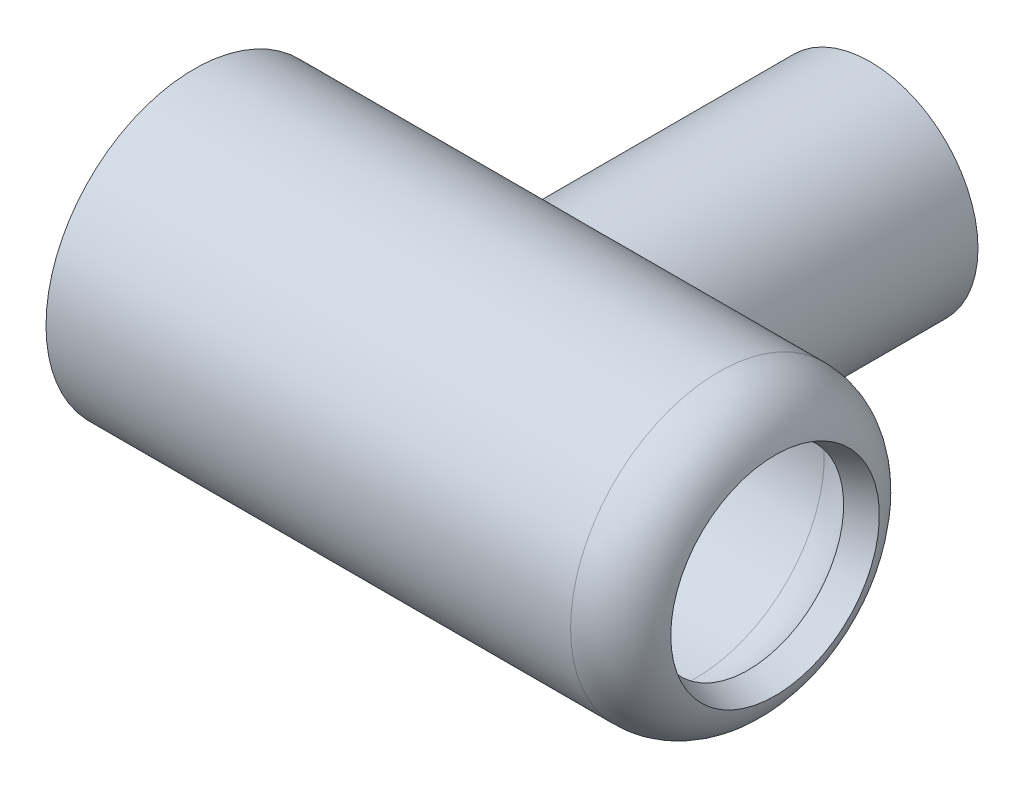
ISO-10303-21;
HEADER;
FILE_DESCRIPTION(('STEP AP214'),'2;1');
FILE_NAME('part.step','',(''),(''),'','','');
FILE_SCHEMA(('AUTOMOTIVE_DESIGN { 1 0 10303 214 1 1 1 1 }'));
ENDSEC;
DATA;
#1=APPLICATION_CONTEXT('core data for automotive mechanical design processes');
#2=APPLICATION_PROTOCOL_DEFINITION('international standard','automotive_design',2000,#1);
#3=PRODUCT_CONTEXT('',#1,'mechanical');
#4=PRODUCT('Part','Part','',(#3));
#5=PRODUCT_RELATED_PRODUCT_CATEGORY('part','',(#4));
#6=PRODUCT_DEFINITION_FORMATION('','',#4);
#7=PRODUCT_DEFINITION_CONTEXT('part definition',#1,'design');
#8=PRODUCT_DEFINITION('design','',#6,#7);
#9=PRODUCT_DEFINITION_SHAPE('','',#8);
#10=(LENGTH_UNIT() NAMED_UNIT(*) SI_UNIT(.MILLI.,.METRE.));
#11=(NAMED_UNIT(*) PLANE_ANGLE_UNIT() SI_UNIT($,.RADIAN.));
#12=(NAMED_UNIT(*) SI_UNIT($,.STERADIAN.) SOLID_ANGLE_UNIT());
#13=UNCERTAINTY_MEASURE_WITH_UNIT(LENGTH_MEASURE(1.E-05),#10,'distance_accuracy_value','');
#14=(GEOMETRIC_REPRESENTATION_CONTEXT(3) GLOBAL_UNCERTAINTY_ASSIGNED_CONTEXT((#13)) GLOBAL_UNIT_ASSIGNED_CONTEXT((#10,
#11,#12)) REPRESENTATION_CONTEXT('',''));
#15=CARTESIAN_POINT('',(0.,0.,0.));
#16=DIRECTION('',(0.,0.,1.));
#17=DIRECTION('',(1.,0.,0.));
#18=AXIS2_PLACEMENT_3D('',#15,#16,#17);
#19=CARTESIAN_POINT('',(0.,0.,-30.));
#20=DIRECTION('',(0.,0.,1.));
#21=DIRECTION('',(1.,0.,0.));
#22=AXIS2_PLACEMENT_3D('',#19,#20,#21);
#23=CYLINDRICAL_SURFACE('',#22,9.25);
#24=CARTESIAN_POINT('',(9.25,0.,-11.05));
#25=CARTESIAN_POINT('',(9.24999984790177,-0.219475563396185,-11.0499998511439));
#26=CARTESIAN_POINT('',(9.24217594061111,-0.438953172904047,-11.043447960009));
#27=CARTESIAN_POINT('',(9.21103047976468,-0.87602698176633,-11.017395795229));
#28=CARTESIAN_POINT('',(9.18770866791062,-1.09362314970217,-10.9978953057739));
#29=CARTESIAN_POINT('',(9.12599057821345,-1.52523537385702,-10.9463882344754));
#30=CARTESIAN_POINT('',(9.08758873725162,-1.7392500784386,-10.914377037373));
#31=CARTESIAN_POINT('',(8.99638048454629,-2.16203909123416,-10.8385524852219));
#32=CARTESIAN_POINT('',(8.94357382332977,-2.37081330862125,-10.7947389257717));
#33=CARTESIAN_POINT('',(8.82476465701185,-2.78051169770847,-10.6965116730655));
#34=CARTESIAN_POINT('',(8.75884613028088,-2.98147656538516,-10.6421654928424));
#35=CARTESIAN_POINT('',(8.6144938345716,-3.37596462433872,-10.5236782544412));
#36=CARTESIAN_POINT('',(8.53605459417016,-3.56948451614403,-10.4595329146602));
#37=CARTESIAN_POINT('',(8.36762935225269,-3.94819258808527,-10.3225394304284));
#38=CARTESIAN_POINT('',(8.27764453746544,-4.13338162188209,-10.2496921804692));
#39=CARTESIAN_POINT('',(8.08702217098376,-4.49492548486011,-10.0963717258381));
#40=CARTESIAN_POINT('',(7.98638234843411,-4.67127841899545,-10.0158968959177));
#41=CARTESIAN_POINT('',(7.73630076915851,-5.07822288901348,-9.81746366437749));
#42=CARTESIAN_POINT('',(7.58256266278203,-5.30479121887937,-9.69663853512004));
#43=CARTESIAN_POINT('',(7.25857034686547,-5.74015201427548,-9.44544152437032));
#44=CARTESIAN_POINT('',(7.08831051742851,-5.94893838557251,-9.31506639815043));
#45=CARTESIAN_POINT('',(6.73233467193815,-6.34901945352247,-9.04712936638895));
#46=CARTESIAN_POINT('',(6.54658104001906,-6.54026906591065,-8.90955029105953));
#47=CARTESIAN_POINT('',(6.16106222659249,-6.90464828624756,-8.63023868712287));
#48=CARTESIAN_POINT('',(5.96129882599346,-7.07778019035416,-8.48850668776014));
#49=CARTESIAN_POINT('',(5.54444735031626,-7.40903552787645,-8.20107647547176));
#50=CARTESIAN_POINT('',(5.32710513637502,-7.56681771086846,-8.05535365969262));
#51=CARTESIAN_POINT('',(4.87848193491632,-7.86354173275174,-7.76596131282176));
#52=CARTESIAN_POINT('',(4.64719631329281,-8.00247725751861,-7.62229248422018));
#53=CARTESIAN_POINT('',(4.17088447243069,-8.26071590138977,-7.3416157162202));
#54=CARTESIAN_POINT('',(3.92589186217582,-8.38006444224244,-7.20459290047123));
#55=CARTESIAN_POINT('',(3.42117370370125,-8.59846987347771,-6.94246942818835));
#56=CARTESIAN_POINT('',(3.16146088218024,-8.69754396093022,-6.81735871622195));
#57=CARTESIAN_POINT('',(2.60263157237528,-8.88158619091727,-6.57608525962632));
#58=CARTESIAN_POINT('',(2.30205617550612,-8.96455900794652,-6.46166581235096));
#59=CARTESIAN_POINT('',(1.83837107993512,-9.06685765100913,-6.3164969444914));
#60=CARTESIAN_POINT('',(1.68177841068803,-9.09725118558168,-6.27253738536209));
#61=CARTESIAN_POINT('',(1.36475820022087,-9.15017643329354,-6.19507607178537));
#62=CARTESIAN_POINT('',(1.2043327367338,-9.17271230713419,-6.16156878376063));
#63=CARTESIAN_POINT('',(0.878321086676945,-9.20968572687295,-6.10617114944698));
#64=CARTESIAN_POINT('',(0.712694687428108,-9.22401203455807,-6.08444057993509));
#65=CARTESIAN_POINT('',(0.379690168949532,-9.24370832633351,-6.05447637054362));
#66=CARTESIAN_POINT('',(0.212312226858201,-9.24907920746872,-6.04624137884387));
#67=CARTESIAN_POINT('',(-0.122573752384285,-9.25070314279064,-6.04375667710054));
#68=CARTESIAN_POINT('',(-0.290081771059277,-9.24695731531173,-6.04950525171168));
#69=CARTESIAN_POINT('',(-0.623621637092969,-9.23046528863819,-6.07463818081445));
#70=CARTESIAN_POINT('',(-0.789653309112418,-9.21771803446674,-6.09402413362041));
#71=CARTESIAN_POINT('',(-1.13075416725186,-9.18234118326979,-6.14721048205164));
#72=CARTESIAN_POINT('',(-1.30560744269212,-9.15906296095605,-6.18195281152572));
#73=CARTESIAN_POINT('',(-1.65089631252135,-9.10316816209196,-6.26396677829748));
#74=CARTESIAN_POINT('',(-1.82132872099878,-9.07054504441998,-6.31124719011653));
#75=CARTESIAN_POINT('',(-2.15746224667918,-8.99653061015856,-6.41631256281838));
#76=CARTESIAN_POINT('',(-2.32314906907296,-8.95511543551775,-6.47412604436921));
#77=CARTESIAN_POINT('',(-2.64900654193515,-8.8641906278843,-6.59807084176366));
#78=CARTESIAN_POINT('',(-2.80917827394678,-8.81468259302302,-6.66420051478017));
#79=CARTESIAN_POINT('',(-3.21836227995002,-8.67613466863344,-6.84446347956587));
#80=CARTESIAN_POINT('',(-3.46315997680085,-8.58117111020339,-6.96363557629632));
#81=CARTESIAN_POINT('',(-3.93948014549122,-8.37320647392234,-7.21236812006209));
#82=CARTESIAN_POINT('',(-4.17099452608335,-8.26019455757433,-7.34193478588424));
#83=CARTESIAN_POINT('',(-4.62161999050188,-8.01678089945095,-7.60698056137561));
#84=CARTESIAN_POINT('',(-4.84071366113781,-7.88635556387881,-7.74246752200296));
#85=CARTESIAN_POINT('',(-5.2664513599173,-7.60865057506423,-8.01553948277696));
#86=CARTESIAN_POINT('',(-5.47309792897594,-7.46137437962793,-8.15312404748959));
#87=CARTESIAN_POINT('',(-5.88520606722834,-7.14133537435293,-8.4351550590827));
#88=CARTESIAN_POINT('',(-6.08995172036423,-6.96760661415703,-8.57955377456256));
#89=CARTESIAN_POINT('',(-6.48506561607858,-6.60143679304037,-8.86438675000016));
#90=CARTESIAN_POINT('',(-6.67543173961235,-6.40899298369074,-9.00482042374598));
#91=CARTESIAN_POINT('',(-7.04037482068938,-6.0057825166619,-9.27859691115925));
#92=CARTESIAN_POINT('',(-7.21497980693657,-5.79504974698625,-9.41195213145355));
#93=CARTESIAN_POINT('',(-7.54723479240589,-5.35515294864625,-9.66900643646152));
#94=CARTESIAN_POINT('',(-7.7048901898419,-5.12599482908953,-9.79270859208347));
#95=CARTESIAN_POINT('',(-7.96639712522203,-4.70584699833509,-9.99993609582096));
#96=CARTESIAN_POINT('',(-8.07417652533914,-4.5185755383881,-10.0860631142266));
#97=CARTESIAN_POINT('',(-8.2776723806442,-4.1339984927832,-10.2496926535089));
#98=CARTESIAN_POINT('',(-8.37339164327219,-3.93669525745518,-10.3271971810938));
#99=CARTESIAN_POINT('',(-8.5516586903294,-3.53275393327006,-10.4722578309749));
#100=CARTESIAN_POINT('',(-8.63421042881198,-3.32611867071776,-10.5398169392926));
#101=CARTESIAN_POINT('',(-8.78504459717026,-2.90441536254658,-10.6637310105243));
#102=CARTESIAN_POINT('',(-8.85332681533589,-2.68934719186889,-10.7200858072048));
#103=CARTESIAN_POINT('',(-8.97501703344195,-2.25030449869418,-10.8208019252237));
#104=CARTESIAN_POINT('',(-9.02830005161572,-2.02627193837988,-10.8650623853341));
#105=CARTESIAN_POINT('',(-9.11826608955385,-1.5726358520789,-10.9399338934061));
#106=CARTESIAN_POINT('',(-9.15494905809863,-1.34303230890522,-10.9705448992523));
#107=CARTESIAN_POINT('',(-9.21095389091431,-0.880390477995762,-11.0173242820229));
#108=CARTESIAN_POINT('',(-9.23028607051114,-0.647354314887699,-11.0335012401896));
#109=CARTESIAN_POINT('',(-9.2512068385087,-0.179942402138984,-11.051008719203));
#110=CARTESIAN_POINT('',(-9.25279752844771,0.054433185551671,-11.052340998451));
#111=CARTESIAN_POINT('',(-9.23912614314128,0.492932287943069,-11.0408986840311));
#112=CARTESIAN_POINT('',(-9.22594791295366,0.697171565561707,-11.029868393726));
#113=CARTESIAN_POINT('',(-9.18621730788201,1.10343163356705,-10.9966571634153));
#114=CARTESIAN_POINT('',(-9.15966489329301,1.30545241736573,-10.9744761903059));
#115=CARTESIAN_POINT('',(-9.09360761071867,1.70586671239275,-10.9194032536993));
#116=CARTESIAN_POINT('',(-9.05410289728158,1.90426026687177,-10.8865114180054));
#117=CARTESIAN_POINT('',(-8.96272538004675,2.29620385341426,-10.8106335825424));
#118=CARTESIAN_POINT('',(-8.91085199344209,2.48975365676713,-10.7676471071194));
#119=CARTESIAN_POINT('',(-8.79507814043273,2.87215269129954,-10.672034837037));
#120=CARTESIAN_POINT('',(-8.73110487663713,3.06096519937795,-10.6193507522073));
#121=CARTESIAN_POINT('',(-8.59209609707458,3.43185452968389,-10.5053573398748));
#122=CARTESIAN_POINT('',(-8.51705658043059,3.61392888590253,-10.4440448932548));
#123=CARTESIAN_POINT('',(-8.35672379659058,3.97063015194817,-10.3137118305782));
#124=CARTESIAN_POINT('',(-8.27143075731352,4.14525722719914,-10.2446913858601));
#125=CARTESIAN_POINT('',(-8.09134678774751,4.48663196442822,-10.0998530668948));
#126=CARTESIAN_POINT('',(-7.99655394752557,4.65337803197465,-10.0240338260748));
#127=CARTESIAN_POINT('',(-7.75385489804663,5.05135585812689,-9.83130905509905));
#128=CARTESIAN_POINT('',(-7.60113967445834,5.27811622144453,-9.71118073621462));
#129=CARTESIAN_POINT('',(-7.27919303483013,5.71395812791693,-9.46130740518942));
#130=CARTESIAN_POINT('',(-7.10995530416116,5.92303285448717,-9.33155872089676));
#131=CARTESIAN_POINT('',(-6.75601390173961,6.32379932709354,-9.06477520340999));
#132=CARTESIAN_POINT('',(-6.57127068873758,6.5154438635509,-8.92772208860068));
#133=CARTESIAN_POINT('',(-6.18779517724358,6.88068386893602,-8.64935849324016));
#134=CARTESIAN_POINT('',(-5.98906478513463,7.05428178956968,-8.50804859436341));
#135=CARTESIAN_POINT('',(-5.57446183290055,7.38645486831052,-8.22142060236954));
#136=CARTESIAN_POINT('',(-5.35834410930944,7.54470124995016,-8.0760762550596));
#137=CARTESIAN_POINT('',(-4.9122527241925,7.84246355423085,-7.78725124284645));
#138=CARTESIAN_POINT('',(-4.68227458783142,7.98197338033372,-7.64377119820436));
#139=CARTESIAN_POINT('',(-4.20866647991528,8.24150243000036,-7.36318828644399));
#140=CARTESIAN_POINT('',(-3.96506894371241,8.36156551264742,-7.22607158099784));
#141=CARTESIAN_POINT('',(-3.46325642757647,8.58157416449509,-6.96336173804626));
#142=CARTESIAN_POINT('',(-3.20505357991527,8.68153612567745,-6.8377592568258));
#143=CARTESIAN_POINT('',(-2.64721232619546,8.86844052572504,-6.59386432162918));
#144=CARTESIAN_POINT('',(-2.34597680629879,8.95320749525155,-6.47743542289903));
#145=CARTESIAN_POINT('',(-1.88106347759939,9.05810689362251,-6.32905281128194));
#146=CARTESIAN_POINT('',(-1.72401742116224,9.08935231946447,-6.28398861202101));
#147=CARTESIAN_POINT('',(-1.40599004601853,9.14394286495775,-6.20428375609671));
#148=CARTESIAN_POINT('',(-1.24501086891687,9.16729218562756,-6.16963755776436));
#149=CARTESIAN_POINT('',(-0.917703090484504,9.2058586882448,-6.11194733867261));
#150=CARTESIAN_POINT('',(-0.751331504840967,9.22096089246174,-6.08906760433492));
#151=CARTESIAN_POINT('',(-0.416702137389746,9.24212924471384,-6.05689067997035));
#152=CARTESIAN_POINT('',(-0.248444555980082,9.24819634378122,-6.04759206040175));
#153=CARTESIAN_POINT('',(0.088299980892322,9.25111050047042,-6.04313357048401));
#154=CARTESIAN_POINT('',(0.256786868961206,9.24795984901919,-6.04797018704389));
#155=CARTESIAN_POINT('',(0.592369066327459,9.23254161063474,-6.07147971234821));
#156=CARTESIAN_POINT('',(0.759464219882389,9.22027301685636,-6.09015414912778));
#157=CARTESIAN_POINT('',(1.10079575913172,9.18596326507257,-6.14179043987249));
#158=CARTESIAN_POINT('',(1.27485590263164,9.16337788695835,-6.17554526166872));
#159=CARTESIAN_POINT('',(1.61866637909767,9.10893802670849,-6.2555637468479));
#160=CARTESIAN_POINT('',(1.78841365368383,9.07707715610996,-6.30183603002838));
#161=CARTESIAN_POINT('',(2.12326624809853,9.00464733630164,-6.40490388828262));
#162=CARTESIAN_POINT('',(2.28835747629999,8.96405461574073,-6.4617281307979));
#163=CARTESIAN_POINT('',(2.61309608067021,8.87482856202199,-6.58374031539569));
#164=CARTESIAN_POINT('',(2.7727445004142,8.82619678080878,-6.64892664263064));
#165=CARTESIAN_POINT('',(3.1803193932837,8.69010434752907,-6.82667315838651));
#166=CARTESIAN_POINT('',(3.42409302635456,8.59678715339463,-6.94429602563036));
#167=CARTESIAN_POINT('',(3.89851395476224,8.39231014596728,-7.19007955357911));
#168=CARTESIAN_POINT('',(4.12915322378428,8.28113957778845,-7.31824654322928));
#169=CARTESIAN_POINT('',(4.57817437077003,8.04161895829167,-7.58066462032145));
#170=CARTESIAN_POINT('',(4.79653898412107,7.91324552855143,-7.71492381980958));
#171=CARTESIAN_POINT('',(5.22098135669022,7.63986625752204,-7.98573584082098));
#172=CARTESIAN_POINT('',(5.42706162220897,7.49486382672016,-8.12228818715024));
#173=CARTESIAN_POINT('',(5.83850694174697,7.17950753313178,-8.40263133436963));
#174=CARTESIAN_POINT('',(6.04314761575141,7.00817470253424,-8.54638621017379));
#175=CARTESIAN_POINT('',(6.43827414331525,6.64701152361345,-8.83020405202089));
#176=CARTESIAN_POINT('',(6.62875794507175,6.45717850317505,-8.9702664810143));
#177=CARTESIAN_POINT('',(6.99423697914736,6.05937092246888,-9.243629055484));
#178=CARTESIAN_POINT('',(7.16925804952493,5.85142782485,-9.37694031662278));
#179=CARTESIAN_POINT('',(7.50268772686891,5.41729025495941,-9.63426671657479));
#180=CARTESIAN_POINT('',(7.66110141267936,5.19110140023934,-9.75828469411667));
#181=CARTESIAN_POINT('',(7.92561464773022,4.77425188645936,-9.96746700868186));
#182=CARTESIAN_POINT('',(8.03543193349589,4.58716334301638,-10.0550653418387));
#183=CARTESIAN_POINT('',(8.24299109215213,4.20277088922744,-10.2216961402801));
#184=CARTESIAN_POINT('',(8.34073575619631,4.00546935511982,-10.3007305849893));
#185=CARTESIAN_POINT('',(8.52300362727653,3.60138900070962,-10.4488647359781));
#186=CARTESIAN_POINT('',(8.60753448996895,3.3946157584839,-10.5179701929067));
#187=CARTESIAN_POINT('',(8.76228737968885,2.97243129794445,-10.6449859281971));
#188=CARTESIAN_POINT('',(8.83251029766092,2.75702061847752,-10.702896903619));
#189=CARTESIAN_POINT('',(8.9528535300728,2.33524049858642,-10.8024317230301));
#190=CARTESIAN_POINT('',(9.00408435445501,2.12939936554257,-10.8449496199054));
#191=CARTESIAN_POINT('',(9.09255019859767,1.71271175399497,-10.9185101727583));
#192=CARTESIAN_POINT('',(9.12978616090286,1.50186561359239,-10.9495536015314));
#193=CARTESIAN_POINT('',(9.18962281503975,1.0767492865727,-10.9994952443513));
#194=CARTESIAN_POINT('',(9.21222853537133,0.862480302380759,-11.0183976313283));
#195=CARTESIAN_POINT('',(9.24241733580852,0.432141561064338,-11.043650193628));
#196=CARTESIAN_POINT('',(9.25000014973937,0.216071772101443,-11.0500001465475));
#197=CARTESIAN_POINT('',(9.25,0.,-11.05));
#198=B_SPLINE_CURVE_WITH_KNOTS('',3,(#24,#25,#26,#27,#28,#29,#30,#31,#32,#33,#34,#35,#36,#37,
#38,#39,#40,#41,#42,#43,#44,#45,#46,#47,#48,#49,#50,#51,#52,#53,#54,#55,#56,#57,#58,#59,#60,#61,
#62,#63,#64,#65,#66,#67,#68,#69,#70,#71,#72,#73,#74,#75,#76,#77,#78,#79,#80,#81,#82,#83,#84,#85,
#86,#87,#88,#89,#90,#91,#92,#93,#94,#95,#96,#97,#98,#99,#100,#101,#102,#103,#104,#105,#106,#107,
#108,#109,#110,#111,#112,#113,#114,#115,#116,#117,#118,#119,#120,#121,#122,#123,#124,#125,#126,
#127,#128,#129,#130,#131,#132,#133,#134,#135,#136,#137,#138,#139,#140,#141,#142,#143,#144,#145,
#146,#147,#148,#149,#150,#151,#152,#153,#154,#155,#156,#157,#158,#159,#160,#161,#162,#163,#164,
#165,#166,#167,#168,#169,#170,#171,#172,#173,#174,#175,#176,#177,#178,#179,#180,#181,#182,#183,
#184,#185,#186,#187,#188,#189,#190,#191,#192,#193,#194,#195,#196,#197),.UNSPECIFIED.,.T.,.F.,(4,
2,2,2,2,2,2,2,2,2,2,2,2,2,2,2,2,2,2,2,2,2,2,2,2,2,2,2,2,2,2,2,2,2,2,2,2,2,2,2,2,2,2,2,2,2,2,2,2,
2,2,2,2,2,2,2,2,2,2,2,2,2,2,2,2,2,2,2,2,2,2,2,2,2,2,2,2,2,2,2,2,2,2,2,2,2,4),(0.,
0.658195646689237,1.31640226357668,1.97485192552973,2.63331299171081,3.28768521724641,
3.94234418352291,4.59693591354437,5.25166743575531,6.14820913167326,7.04505686420874,
7.94414914316033,8.84312733679823,9.75891849503526,10.6750157135187,11.5889575517297,
12.5021209289998,13.4952592476201,13.9911835897118,14.4868449352297,14.9890725915929,
15.4912499379216,15.9933656859366,16.4955402922246,17.0340699475861,17.5729774811206,
18.1133665220052,18.6536489786078,19.5173522653488,20.3815761918042,21.2469831865889,
22.1122129167721,23.0259492700112,23.9398200147055,24.8520321762132,25.7639529444673,
26.4611458530952,27.1581761634193,27.8549967680416,28.5518277103248,29.2543038816235,
29.9567822204023,30.6588426472191,31.3608199117668,31.9749602626679,32.5891024368247,
33.2032372832361,33.8174010731561,34.4353847380697,35.053592378146,35.6717862790217,
36.2901047179471,37.1846588957046,38.0795563056963,38.9768095322931,39.8739407036665,
40.78730961455,41.7009750029232,42.6125501715329,43.5233789306775,44.5217700795331,
45.0203458487147,45.5186559383743,46.0237465664841,46.5287840251606,47.0336959753825,
47.5386636885914,48.0740532028469,48.6098123406839,49.1470489026753,49.6841818717463,
50.5417453288254,51.3998273340518,52.2590875144917,53.1181717810169,54.0267202923419,
54.9354002268892,55.8425318548439,56.7493852509728,57.4506298372784,58.1517119932693,
58.8523864469486,59.5530172568312,60.2012602070738,60.849459490754,61.4974358660589,
62.1454237220594),.UNSPECIFIED.);
#199=CARTESIAN_POINT('',(5.24022900262957,-7.6224995900295,-8.));
#200=VERTEX_POINT('',#199);
#201=CARTESIAN_POINT('',(-5.24022900262957,-7.6224995900295,-8.));
#202=VERTEX_POINT('',#201);
#203=EDGE_CURVE('E82',#200,#202,#198,.T.);
#204=ORIENTED_EDGE('',*,*,#203,.F.);
#205=CARTESIAN_POINT('',(0.,0.,-8.));
#206=DIRECTION('',(0.,0.,1.));
#207=DIRECTION('',(1.,0.,0.));
#208=AXIS2_PLACEMENT_3D('',#205,#206,#207);
#209=CIRCLE('',#208,9.25);
#210=EDGE_CURVE('E11',#200,#202,#209,.F.);
#211=ORIENTED_EDGE('',*,*,#210,.T.);
#212=EDGE_LOOP('',(#204,#211));
#213=FACE_BOUND('',#212,.T.);
#214=ADVANCED_FACE('F35',(#213),#23,.F.);
#215=CARTESIAN_POINT('',(20.,0.,0.));
#216=DIRECTION('',(-1.,0.,0.));
#217=DIRECTION('',(0.,0.,1.));
#218=AXIS2_PLACEMENT_3D('',#215,#216,#217);
#219=TOROIDAL_SURFACE('',#218,7.7,5.);
#220=CARTESIAN_POINT('',(20.,0.,0.));
#221=DIRECTION('',(-1.,0.,0.));
#222=DIRECTION('',(0.,0.,1.));
#223=AXIS2_PLACEMENT_3D('',#220,#221,#222);
#224=CIRCLE('',#223,12.7);
#225=CARTESIAN_POINT('',(20.,0.,12.7));
#226=VERTEX_POINT('',#225);
#227=EDGE_CURVE('E148',#226,#226,#224,.T.);
#228=ORIENTED_EDGE('',*,*,#227,.F.);
#229=EDGE_LOOP('',(#228));
#230=FACE_BOUND('',#229,.T.);
#231=CARTESIAN_POINT('',(24.841923498959,0.,0.));
#232=DIRECTION('',(-1.,0.,0.));
#233=DIRECTION('',(0.,0.,1.));
#234=AXIS2_PLACEMENT_3D('',#231,#232,#233);
#235=CIRCLE('',#234,8.94730783298631);
#236=CARTESIAN_POINT('',(24.841923498959,0.,8.94730783298631));
#237=VERTEX_POINT('',#236);
#238=EDGE_CURVE('E127',#237,#237,#235,.F.);
#239=ORIENTED_EDGE('',*,*,#238,.F.);
#240=EDGE_LOOP('',(#239));
#241=FACE_BOUND('',#240,.T.);
#242=ADVANCED_FACE('F109',(#230,#241),#219,.T.);
#243=CARTESIAN_POINT('',(18.0198110801731,0.,0.));
#244=DIRECTION('',(-1.,0.,0.));
#245=DIRECTION('',(0.,0.,1.));
#246=AXIS2_PLACEMENT_3D('',#243,#244,#245);
#247=TOROIDAL_SURFACE('',#246,6.05,5.);
#248=CARTESIAN_POINT('',(18.0198110801731,0.,0.));
#249=DIRECTION('',(-1.,0.,0.));
#250=DIRECTION('',(0.,0.,1.));
#251=AXIS2_PLACEMENT_3D('',#248,#249,#250);
#252=CIRCLE('',#251,11.05);
#253=CARTESIAN_POINT('',(18.0198110801731,0.,11.05));
#254=VERTEX_POINT('',#253);
#255=EDGE_CURVE('E140',#254,#254,#252,.T.);
#256=ORIENTED_EDGE('',*,*,#255,.T.);
#257=EDGE_LOOP('',(#256));
#258=FACE_BOUND('',#257,.T.);
#259=CARTESIAN_POINT('',(22.542961879778,0.,0.));
#260=DIRECTION('',(-1.,0.,0.));
#261=DIRECTION('',(0.,0.,1.));
#262=AXIS2_PLACEMENT_3D('',#259,#260,#261);
#263=CIRCLE('',#262,8.18098729325934);
#264=CARTESIAN_POINT('',(22.542961879778,0.,8.18098729325934));
#265=VERTEX_POINT('',#264);
#266=EDGE_CURVE('E83',#265,#265,#263,.T.);
#267=ORIENTED_EDGE('',*,*,#266,.F.);
#268=EDGE_LOOP('',(#267));
#269=FACE_BOUND('',#268,.T.);
#270=ADVANCED_FACE('F114',(#258,#269),#247,.F.);
#271=CARTESIAN_POINT('',(-25.,11.05,0.));
#272=DIRECTION('',(1.,0.,0.));
#273=DIRECTION('',(0.,0.,-1.));
#274=AXIS2_PLACEMENT_3D('',#271,#272,#273);
#275=PLANE('',#274);
#276=CARTESIAN_POINT('',(-25.,0.,0.));
#277=DIRECTION('',(-1.,0.,0.));
#278=DIRECTION('',(0.,0.,1.));
#279=AXIS2_PLACEMENT_3D('',#276,#277,#278);
#280=CIRCLE('',#279,11.05);
#281=CARTESIAN_POINT('',(-25.,0.,11.05));
#282=VERTEX_POINT('',#281);
#283=EDGE_CURVE('E143',#282,#282,#280,.T.);
#284=ORIENTED_EDGE('',*,*,#283,.F.);
#285=EDGE_LOOP('',(#284));
#286=FACE_BOUND('',#285,.T.);
#287=CARTESIAN_POINT('',(-25.,0.,0.));
#288=DIRECTION('',(-1.,0.,0.));
#289=DIRECTION('',(0.,0.,1.));
#290=AXIS2_PLACEMENT_3D('',#287,#288,#289);
#291=CIRCLE('',#290,12.7);
#292=CARTESIAN_POINT('',(-25.,0.,12.7));
#293=VERTEX_POINT('',#292);
#294=EDGE_CURVE('E43',#293,#293,#291,.T.);
#295=ORIENTED_EDGE('',*,*,#294,.T.);
#296=EDGE_LOOP('',(#295));
#297=FACE_BOUND('',#296,.T.);
#298=ADVANCED_FACE('F37',(#286,#297),#275,.F.);
#299=CARTESIAN_POINT('',(-16.3508782201405,0.,0.));
#300=DIRECTION('',(-1.,0.,0.));
#301=DIRECTION('',(0.,0.,1.));
#302=AXIS2_PLACEMENT_3D('',#299,#300,#301);
#303=CYLINDRICAL_SURFACE('',#302,12.7);
#304=CARTESIAN_POINT('',(9.25,0.,-12.7));
#305=CARTESIAN_POINT('',(9.24999775552965,0.227497337947393,-12.6999978448739));
#306=CARTESIAN_POINT('',(9.24159196095742,0.455058623896146,-12.693871981559));
#307=CARTESIAN_POINT('',(9.20809602337804,0.908397768636302,-12.6695068691463));
#308=CARTESIAN_POINT('',(9.18299554363044,1.13417443476401,-12.6512601152438));
#309=CARTESIAN_POINT('',(9.11644474507044,1.58253043168526,-12.6030368434298));
#310=CARTESIAN_POINT('',(9.07495956537258,1.80510188950057,-12.5730353165828));
#311=CARTESIAN_POINT('',(8.97627677103815,2.24494338561071,-12.5019947586479));
#312=CARTESIAN_POINT('',(8.91907733093706,2.46221280479362,-12.4609544452388));
#313=CARTESIAN_POINT('',(8.79016908837589,2.88873038789043,-12.3690155235329));
#314=CARTESIAN_POINT('',(8.71855113500222,3.09801947224912,-12.3181787234372));
#315=CARTESIAN_POINT('',(8.56146904882757,3.50886348774257,-12.2075036840644));
#316=CARTESIAN_POINT('',(8.47600446975168,3.71041816933951,-12.1476651546671));
#317=CARTESIAN_POINT('',(8.29219394466985,4.10479276497837,-12.0201332161094));
#318=CARTESIAN_POINT('',(8.19385633278199,4.29761822262303,-11.9524448921848));
#319=CARTESIAN_POINT('',(7.98509748966168,4.67408469385908,-11.81031056227));
#320=CARTESIAN_POINT('',(7.87467208646203,4.85772250437135,-11.7358622246573));
#321=CARTESIAN_POINT('',(7.632031050348,5.2315060297549,-11.5743882969629));
#322=CARTESIAN_POINT('',(7.49874735767736,5.42072979637084,-11.4868344514325));
#323=CARTESIAN_POINT('',(7.21969985358629,5.78718310892157,-11.3066446228487));
#324=CARTESIAN_POINT('',(7.07393449616807,5.96441116416777,-11.2140080107482));
#325=CARTESIAN_POINT('',(6.77045226490591,6.30681352432602,-11.0250802067687));
#326=CARTESIAN_POINT('',(6.61271671038258,6.4719681648922,-10.9287834247682));
#327=CARTESIAN_POINT('',(6.28615132399003,6.78960049925168,-10.7343372314835));
#328=CARTESIAN_POINT('',(6.11732468371443,6.9420818115868,-10.6361883589052));
#329=CARTESIAN_POINT('',(5.73552817584094,7.2622057644727,-10.4208614570598));
#330=CARTESIAN_POINT('',(5.52030350456303,7.42714445751486,-10.3036453462798));
#331=CARTESIAN_POINT('',(5.07507268981407,7.73821090625323,-10.0721244971018));
#332=CARTESIAN_POINT('',(4.84506236194887,7.88433330141978,-9.95782059576283));
#333=CARTESIAN_POINT('',(4.37088530948964,8.15674860088281,-9.73592692615065));
#334=CARTESIAN_POINT('',(4.12673519387093,8.28306414893823,-9.62832957684015));
#335=CARTESIAN_POINT('',(3.62443642652803,8.51483270125321,-9.42398423087872));
#336=CARTESIAN_POINT('',(3.36629565762845,8.62029730112501,-9.32723021708254));
#337=CARTESIAN_POINT('',(2.92420203745972,8.77764070803567,-9.1788110244831));
#338=CARTESIAN_POINT('',(2.74389355708014,8.83571525617493,-9.12280594183249));
#339=CARTESIAN_POINT('',(2.37777887736829,8.94119312200592,-9.01945214577908));
#340=CARTESIAN_POINT('',(2.19197442032569,8.9885997813799,-8.97210072252057));
#341=CARTESIAN_POINT('',(1.81588195862567,9.0720504670981,-8.88771205856938));
#342=CARTESIAN_POINT('',(1.62560284705969,9.10811527115502,-8.85065597202734));
#343=CARTESIAN_POINT('',(1.2412640411032,9.16840174511015,-8.78819109240997));
#344=CARTESIAN_POINT('',(1.04720436066116,9.19262345869498,-8.76278225637045));
#345=CARTESIAN_POINT('',(0.65520676094939,9.22888023721227,-8.72459038102092));
#346=CARTESIAN_POINT('',(0.457250636784491,9.24082209603265,-8.71190392436783));
#347=CARTESIAN_POINT('',(0.0605779270172903,9.2519292833246,-8.70010763289236));
#348=CARTESIAN_POINT('',(-0.138138630118347,9.25109508547713,-8.7009972947262));
#349=CARTESIAN_POINT('',(-0.534702003239556,9.23666533860157,-8.7163134763842));
#350=CARTESIAN_POINT('',(-0.732548196522597,9.22306179704738,-8.73074847443811));
#351=CARTESIAN_POINT('',(-1.12560817778747,9.18338421768442,-8.77247251845071));
#352=CARTESIAN_POINT('',(-1.3208216688602,9.15730878522351,-8.79976300195134));
#353=CARTESIAN_POINT('',(-1.72928983017038,9.08953520593113,-8.86977887314796));
#354=CARTESIAN_POINT('',(-1.94206429823556,9.046394981791,-8.91390913870935));
#355=CARTESIAN_POINT('',(-2.36123442397036,8.94614847723056,-9.0145146593501));
#356=CARTESIAN_POINT('',(-2.5676291557739,8.88904018029796,-9.07099169675619));
#357=CARTESIAN_POINT('',(-3.17673061275179,8.69782075843905,-9.25576577237004));
#358=CARTESIAN_POINT('',(-3.56880449866105,8.5439098070468,-9.39930113537969));
#359=CARTESIAN_POINT('',(-4.19624493308215,8.24813051758972,-9.65833001573775));
#360=CARTESIAN_POINT('',(-4.44062780182628,8.11904924338558,-9.76744617453849));
#361=CARTESIAN_POINT('',(-4.91493511388047,7.8410084784474,-9.99202136661381));
#362=CARTESIAN_POINT('',(-5.14485499535528,7.69204276166846,-10.1074823798455));
#363=CARTESIAN_POINT('',(-5.58992236295057,7.37495943489047,-10.3411225820272));
#364=CARTESIAN_POINT('',(-5.80505626195298,7.20682457740155,-10.4593041412815));
#365=CARTESIAN_POINT('',(-6.21981702746308,6.85206664416553,-10.6950707638381));
#366=CARTESIAN_POINT('',(-6.41944561078695,6.66544562050875,-10.8126558918283));
#367=CARTESIAN_POINT('',(-6.80487547065578,6.27160753620899,-11.0458130475738));
#368=CARTESIAN_POINT('',(-6.99046461299787,6.0641553920778,-11.1613393948726));
#369=CARTESIAN_POINT('',(-7.34372838149935,5.63118176396323,-11.3859240490101));
#370=CARTESIAN_POINT('',(-7.51140112530964,5.40565838571044,-11.4949816756917));
#371=CARTESIAN_POINT('',(-7.82693262659388,4.93772201261491,-11.7036062601268));
#372=CARTESIAN_POINT('',(-7.97482930068131,4.69534273303147,-11.8031912706823));
#373=CARTESIAN_POINT('',(-8.24928901697643,4.19442581669496,-11.9903375803543));
#374=CARTESIAN_POINT('',(-8.3758600850527,3.93589430925623,-12.0779034005701));
#375=CARTESIAN_POINT('',(-8.57617677991944,3.4724749823013,-12.2177978471088));
#376=CARTESIAN_POINT('',(-8.65514751060455,3.27081880027654,-12.2734058808206));
#377=CARTESIAN_POINT('',(-8.79930855064291,2.86040975663414,-12.3754893560091));
#378=CARTESIAN_POINT('',(-8.86450188637223,2.65165846526497,-12.4219668029744));
#379=CARTESIAN_POINT('',(-8.98027467075167,2.2282953923368,-12.5048470805094));
#380=CARTESIAN_POINT('',(-9.03086174644695,2.01368673367202,-12.5412551686411));
#381=CARTESIAN_POINT('',(-9.11676352987143,1.57987651609724,-12.6032532411424));
#382=CARTESIAN_POINT('',(-9.1520778357033,1.36067483648271,-12.6288429408296));
#383=CARTESIAN_POINT('',(-9.20699684002945,0.918442912966964,-12.6686988950395));
#384=CARTESIAN_POINT('',(-9.2265422259311,0.695401407478521,-12.6829223952999));
#385=CARTESIAN_POINT('',(-9.24938559174513,0.248045080687156,-12.6995500753635));
#386=CARTESIAN_POINT('',(-9.25268359927994,0.023730261549666,-12.701954275261));
#387=CARTESIAN_POINT('',(-9.2429778375436,-0.424364777616784,-12.6948859216314));
#388=CARTESIAN_POINT('',(-9.22997343506502,-0.648144976542123,-12.6854129067774));
#389=CARTESIAN_POINT('',(-9.18787438130746,-1.09337212444351,-12.6548143650345));
#390=CARTESIAN_POINT('',(-9.1587801604804,-1.31481913567798,-12.6336891498776));
#391=CARTESIAN_POINT('',(-9.08708131203583,-1.74110963368111,-12.5818112088979));
#392=CARTESIAN_POINT('',(-9.0453475363388,-1.94617681153097,-12.5516803442714));
#393=CARTESIAN_POINT('',(-8.94852010598213,-2.3515815898465,-12.4820823119785));
#394=CARTESIAN_POINT('',(-8.89342190747695,-2.55191755624504,-12.4426119690422));
#395=CARTESIAN_POINT('',(-8.77054187578872,-2.94666257578482,-12.3550818054656));
#396=CARTESIAN_POINT('',(-8.70276325657768,-3.14107311629267,-12.3070241614959));
#397=CARTESIAN_POINT('',(-8.55520200082713,-3.52320742886746,-12.2031240393245));
#398=CARTESIAN_POINT('',(-8.47541495474628,-3.71092871316626,-12.147278702007));
#399=CARTESIAN_POINT('',(-8.29754239010115,-4.09408129940985,-12.0238212319202));
#400=CARTESIAN_POINT('',(-8.19849085365974,-4.28887351086173,-11.9556187122343));
#401=CARTESIAN_POINT('',(-7.988058643786,-4.66911819390237,-11.812308934749));
#402=CARTESIAN_POINT('',(-7.87667282881769,-4.85456672336078,-11.7371987997427));
#403=CARTESIAN_POINT('',(-7.6424006255712,-5.21560502901387,-11.5812840172369));
#404=CARTESIAN_POINT('',(-7.51951102883978,-5.39119203280936,-11.5004777826325));
#405=CARTESIAN_POINT('',(-7.26298022324007,-5.73211468706883,-11.3344088520253));
#406=CARTESIAN_POINT('',(-7.12933770367419,-5.89744908345735,-11.2491456131934));
#407=CARTESIAN_POINT('',(-6.82651787790576,-6.24691588945887,-11.0594963775991));
#408=CARTESIAN_POINT('',(-6.65531451960811,-6.42894752686993,-10.9544674340493));
#409=CARTESIAN_POINT('',(-6.29958439446142,-6.77789138808765,-10.742062377783));
#410=CARTESIAN_POINT('',(-6.11505999636555,-6.94480628811632,-10.6346866847225));
#411=CARTESIAN_POINT('',(-5.73304000554534,-7.26337890248446,-10.4197065293995));
#412=CARTESIAN_POINT('',(-5.53553187024721,-7.41502149456429,-10.3121019460553));
#413=CARTESIAN_POINT('',(-5.12809998913174,-7.70241729544077,-10.099244027165));
#414=CARTESIAN_POINT('',(-4.91817790983823,-7.83817262978375,-9.99399037861706));
#415=CARTESIAN_POINT('',(-4.51145021241329,-8.07826469746208,-9.8006399028041));
#416=CARTESIAN_POINT('',(-4.31598632290005,-8.18441902516553,-9.71197711183758));
#417=CARTESIAN_POINT('',(-3.91569445316561,-8.3833035582608,-9.54082965509789));
#418=CARTESIAN_POINT('',(-3.7108661900383,-8.47603335773252,-9.45834517617595));
#419=CARTESIAN_POINT('',(-3.29246991340516,-8.64714635765436,-9.30216431727592));
#420=CARTESIAN_POINT('',(-3.07891683445856,-8.72555291240136,-9.22845370100459));
#421=CARTESIAN_POINT('',(-2.64334767616888,-8.86722085714753,-9.09241721412003));
#422=CARTESIAN_POINT('',(-2.4213350552938,-8.93048836096085,-9.03008675011941));
#423=CARTESIAN_POINT('',(-2.01902230418669,-9.0287928502515,-8.93166444394412));
#424=CARTESIAN_POINT('',(-1.84016335858516,-9.06697716547636,-8.89281450095174));
#425=CARTESIAN_POINT('',(-1.47874121239024,-9.13288196796492,-8.82511787080327));
#426=CARTESIAN_POINT('',(-1.29618022664505,-9.16060852794946,-8.7962653790147));
#427=CARTESIAN_POINT('',(-0.928504439002111,-9.20514161146901,-8.74965214625542));
#428=CARTESIAN_POINT('',(-0.743392432572543,-9.22195924696764,-8.73188011930684));
#429=CARTESIAN_POINT('',(-0.371726062339842,-9.24440235304274,-8.70811670640765));
#430=CARTESIAN_POINT('',(-0.18517169068611,-9.25002776265833,-8.70212538462319));
#431=CARTESIAN_POINT('',(0.188235807094141,-9.24997198603438,-8.70218469360054));
#432=CARTESIAN_POINT('',(0.375088927895464,-9.24427247894245,-8.70825483676372));
#433=CARTESIAN_POINT('',(0.747338994965377,-9.22164627854246,-8.73221088138447));
#434=CARTESIAN_POINT('',(0.932735946743642,-9.20471962773504,-8.75009673811334));
#435=CARTESIAN_POINT('',(1.30098396867482,-9.15993379653332,-8.79696867443723));
#436=CARTESIAN_POINT('',(1.48383191711764,-9.13206225412448,-8.82596730476922));
#437=CARTESIAN_POINT('',(1.84580671682541,-9.06583615742539,-8.89397889745784));
#438=CARTESIAN_POINT('',(2.02493130728549,-9.02747542332611,-8.93299776250611));
#439=CARTESIAN_POINT('',(2.43189339505413,-8.92773880153538,-9.03282040493497));
#440=CARTESIAN_POINT('',(2.65814746949608,-8.86291089929907,-9.0966457957215));
#441=CARTESIAN_POINT('',(3.10183992368362,-8.7175482890415,-9.23604235197813));
#442=CARTESIAN_POINT('',(3.31927446394954,-8.63700682710117,-9.31161856527817));
#443=CARTESIAN_POINT('',(3.74496843051151,-8.46113554017784,-9.47171254501148));
#444=CARTESIAN_POINT('',(3.95321625503077,-8.36578766624796,-9.55624118388078));
#445=CARTESIAN_POINT('',(4.35996350342221,-8.16119155876647,-9.73155178745269));
#446=CARTESIAN_POINT('',(4.55846358127206,-8.05194425949992,-9.82233333166252));
#447=CARTESIAN_POINT('',(4.95124560905673,-7.81675054476743,-10.010582341603));
#448=CARTESIAN_POINT('',(5.14523379924978,-7.69040879001316,-10.1081677489259));
#449=CARTESIAN_POINT('',(5.52260289052123,-7.42406309516377,-10.3053752959096));
#450=CARTESIAN_POINT('',(5.70598009561176,-7.28405443973838,-10.4049981290815));
#451=CARTESIAN_POINT('',(6.06180805941485,-6.9907191815397,-10.6043054781984));
#452=CARTESIAN_POINT('',(6.23425627933595,-6.83738950377696,-10.7039900030832));
#453=CARTESIAN_POINT('',(6.56773519877151,-6.5177224087132,-10.9015876519123));
#454=CARTESIAN_POINT('',(6.72876563701982,-6.35138469394021,-10.9995007352836));
#455=CARTESIAN_POINT('',(7.07318973507165,-5.96765226311628,-11.2131812266736));
#456=CARTESIAN_POINT('',(7.25363072248038,-5.74711191758438,-11.328096607552));
#457=CARTESIAN_POINT('',(7.59514363363628,-5.28755618425479,-11.5497551248054));
#458=CARTESIAN_POINT('',(7.7562111547904,-5.04853661727646,-11.6564964016319));
#459=CARTESIAN_POINT('',(8.05695151863917,-4.55322813503938,-11.8587351242269));
#460=CARTESIAN_POINT('',(8.19664536882667,-4.29695653775396,-11.9542435887219));
#461=CARTESIAN_POINT('',(8.45265838813299,-3.76844391762165,-12.1312150034563));
#462=CARTESIAN_POINT('',(8.56898970362189,-3.49621128865777,-12.2126852491339));
#463=CARTESIAN_POINT('',(8.74661325800402,-3.01739299587089,-12.3380714867287));
#464=CARTESIAN_POINT('',(8.81414781279236,-2.81416867266454,-12.3860771137803));
#465=CARTESIAN_POINT('',(8.93535785083,-2.40167725222611,-12.4726225969009));
#466=CARTESIAN_POINT('',(8.98903661678471,-2.19241159938944,-12.5111646949581));
#467=CARTESIAN_POINT('',(9.08172447973256,-1.76960728563871,-12.5779246985432));
#468=CARTESIAN_POINT('',(9.12077040941487,-1.55608079789481,-12.6061685212052));
#469=CARTESIAN_POINT('',(9.18381277259783,-1.12575338307965,-12.651855262762));
#470=CARTESIAN_POINT('',(9.20781723846977,-0.908954267098451,-12.6693039463629));
#471=CARTESIAN_POINT('',(9.23274159381107,-0.576432363276341,-12.6874342547005));
#472=CARTESIAN_POINT('',(9.23920962107412,-0.461307945480772,-12.6921426636453));
#473=CARTESIAN_POINT('',(9.24783974229527,-0.230794530386601,-12.6984263367493));
#474=CARTESIAN_POINT('',(9.25000113858127,-0.115405493250548,-12.7000010932585));
#475=CARTESIAN_POINT('',(9.25,0.,-12.7));
#476=B_SPLINE_CURVE_WITH_KNOTS('',3,(#304,#305,#306,#307,#308,#309,#310,#311,#312,#313,#314,
#315,#316,#317,#318,#319,#320,#321,#322,#323,#324,#325,#326,#327,#328,#329,#330,#331,#332,#333,
#334,#335,#336,#337,#338,#339,#340,#341,#342,#343,#344,#345,#346,#347,#348,#349,#350,#351,#352,
#353,#354,#355,#356,#357,#358,#359,#360,#361,#362,#363,#364,#365,#366,#367,#368,#369,#370,#371,
#372,#373,#374,#375,#376,#377,#378,#379,#380,#381,#382,#383,#384,#385,#386,#387,#388,#389,#390,
#391,#392,#393,#394,#395,#396,#397,#398,#399,#400,#401,#402,#403,#404,#405,#406,#407,#408,#409,
#410,#411,#412,#413,#414,#415,#416,#417,#418,#419,#420,#421,#422,#423,#424,#425,#426,#427,#428,
#429,#430,#431,#432,#433,#434,#435,#436,#437,#438,#439,#440,#441,#442,#443,#444,#445,#446,#447,
#448,#449,#450,#451,#452,#453,#454,#455,#456,#457,#458,#459,#460,#461,#462,#463,#464,#465,#466,
#467,#468,#469,#470,#471,#472,#473,#474,#475),.UNSPECIFIED.,.T.,.F.,(4,2,2,2,2,2,2,2,2,2,2,2,2,
2,2,2,2,2,2,2,2,2,2,2,2,2,2,2,2,2,2,2,2,2,2,2,2,2,2,2,2,2,2,2,2,2,2,2,2,2,2,2,2,2,2,2,2,2,2,2,2,
2,2,2,2,2,2,2,2,2,2,2,2,2,2,2,2,2,2,2,2,2,2,2,2,4),(0.,0.682367426085748,1.36515774300299,
2.04940869227949,2.73373916196325,3.41388560487748,4.0940539731834,4.77378415219694,
5.45374967667465,6.19542663313547,6.93719558807327,7.68014694391048,8.42288543515872,
9.30812441827548,10.1936150396573,11.0780858436283,11.9620633842327,12.5541918791567,
13.1461346327124,13.7369865731353,14.327836334016,14.9231383595357,15.5184183138836,
16.1140711116181,16.7097905329912,17.3734197641067,18.0371448572069,19.3662775990479,
20.2567932161495,21.1475883207397,22.039191342013,22.9306954999582,23.8337255034744,
24.7368502888649,25.638217897018,26.5392455150283,27.2093664851056,27.8793401014259,
28.5489632379703,29.2186039943305,29.8907519193534,30.562898701646,31.2350715918278,
31.9072265001958,32.5408198183508,33.1746288581775,33.8082774702414,34.4421593308193,
35.1282679659811,35.8146636894387,36.5012514251934,37.1879229778024,38.0003200112927,
38.8125729381378,39.62562238949,40.4385629388034,41.1563278044013,41.8741143686669,
42.5907199148288,43.3070355739057,43.8674082018501,44.4274549238151,44.9869302757807,
45.5464086750415,46.106792905826,46.6671750152741,47.2281918929598,47.7895400140184,
48.5200165295786,49.2508077091465,49.9824968157915,50.7141367660597,51.467202606217,
52.2205291924031,52.9740301389079,53.7275483217565,54.6480570722472,55.5687746134232,
56.4885813159711,57.4079085584811,58.0656529546734,58.7232413751192,59.3791632642769,
60.0347345819506,60.3808317974506,60.7269850759726),.UNSPECIFIED.);
#477=CARTESIAN_POINT('',(9.25,0.,-12.7));
#478=VERTEX_POINT('',#477);
#479=EDGE_CURVE('E117',#478,#478,#476,.T.);
#480=ORIENTED_EDGE('',*,*,#479,.T.);
#481=EDGE_LOOP('',(#480));
#482=FACE_BOUND('',#481,.T.);
#483=ORIENTED_EDGE('',*,*,#294,.F.);
#484=EDGE_LOOP('',(#483));
#485=FACE_BOUND('',#484,.T.);
#486=ORIENTED_EDGE('',*,*,#227,.T.);
#487=EDGE_LOOP('',(#486));
#488=FACE_BOUND('',#487,.T.);
#489=ADVANCED_FACE('F105',(#482,#485,#488),#303,.T.);
#490=CARTESIAN_POINT('',(-16.3508782201405,0.,0.));
#491=DIRECTION('',(-1.,0.,0.));
#492=DIRECTION('',(0.,0.,1.));
#493=AXIS2_PLACEMENT_3D('',#490,#491,#492);
#494=CYLINDRICAL_SURFACE('',#493,11.05);
#495=ORIENTED_EDGE('',*,*,#203,.T.);
#496=CARTESIAN_POINT('',(-5.24022900262957,7.6224995900295,-8.));
#497=VERTEX_POINT('',#496);
#498=EDGE_CURVE('E64',#202,#497,#198,.T.);
#499=ORIENTED_EDGE('',*,*,#498,.T.);
#500=CARTESIAN_POINT('',(5.24022900262947,7.62249959002988,-7.99999999999966));
#501=VERTEX_POINT('',#500);
#502=EDGE_CURVE('E73',#497,#501,#198,.T.);
#503=ORIENTED_EDGE('',*,*,#502,.T.);
#504=EDGE_CURVE('E77',#501,#200,#198,.T.);
#505=ORIENTED_EDGE('',*,*,#504,.T.);
#506=EDGE_LOOP('',(#495,#499,#503,#505));
#507=FACE_BOUND('',#506,.T.);
#508=ORIENTED_EDGE('',*,*,#255,.F.);
#509=EDGE_LOOP('',(#508));
#510=FACE_BOUND('',#509,.T.);
#511=ORIENTED_EDGE('',*,*,#283,.T.);
#512=EDGE_LOOP('',(#511));
#513=FACE_BOUND('',#512,.T.);
#514=ADVANCED_FACE('F79',(#507,#510,#513),#494,.F.);
#515=CARTESIAN_POINT('',(25.,0.,0.));
#516=DIRECTION('',(1.,0.,0.));
#517=DIRECTION('',(0.,0.,-1.));
#518=AXIS2_PLACEMENT_3D('',#515,#516,#517);
#519=CONICAL_SURFACE('',#518,9.,0.321750554396642);
#520=ORIENTED_EDGE('',*,*,#266,.T.);
#521=EDGE_LOOP('',(#520));
#522=FACE_BOUND('',#521,.T.);
#523=ORIENTED_EDGE('',*,*,#238,.T.);
#524=EDGE_LOOP('',(#523));
#525=FACE_BOUND('',#524,.T.);
#526=ADVANCED_FACE('F97',(#522,#525),#519,.F.);
#527=ORIENTED_EDGE('',*,*,#502,.F.);
#528=CARTESIAN_POINT('',(0.,0.,-8.));
#529=DIRECTION('',(0.,0.,1.));
#530=DIRECTION('',(1.,0.,0.));
#531=AXIS2_PLACEMENT_3D('',#528,#529,#530);
#532=CIRCLE('',#531,9.25);
#533=EDGE_CURVE('E65',#501,#497,#532,.T.);
#534=ORIENTED_EDGE('',*,*,#533,.F.);
#535=EDGE_LOOP('',(#527,#534));
#536=FACE_BOUND('',#535,.T.);
#537=ADVANCED_FACE('F74',(#536),#23,.F.);
#538=CARTESIAN_POINT('',(0.,0.,-33.));
#539=DIRECTION('',(0.,0.,1.));
#540=DIRECTION('',(1.,0.,0.));
#541=AXIS2_PLACEMENT_3D('',#538,#539,#540);
#542=CYLINDRICAL_SURFACE('',#541,9.25);
#543=CARTESIAN_POINT('',(0.,0.,-33.));
#544=DIRECTION('',(0.,0.,1.));
#545=DIRECTION('',(1.,0.,0.));
#546=AXIS2_PLACEMENT_3D('',#543,#544,#545);
#547=CIRCLE('',#546,9.25);
#548=CARTESIAN_POINT('',(9.25,0.,-33.));
#549=VERTEX_POINT('',#548);
#550=EDGE_CURVE('E72',#549,#549,#547,.T.);
#551=ORIENTED_EDGE('',*,*,#550,.T.);
#552=EDGE_LOOP('',(#551));
#553=FACE_BOUND('',#552,.T.);
#554=ORIENTED_EDGE('',*,*,#479,.F.);
#555=EDGE_LOOP('',(#554));
#556=FACE_BOUND('',#555,.T.);
#557=ADVANCED_FACE('F96',(#553,#556),#542,.T.);
#558=ORIENTED_EDGE('',*,*,#504,.F.);
#559=EDGE_CURVE('E50',#200,#501,#532,.T.);
#560=ORIENTED_EDGE('',*,*,#559,.F.);
#561=EDGE_LOOP('',(#558,#560));
#562=FACE_BOUND('',#561,.T.);
#563=ADVANCED_FACE('F189',(#562),#542,.T.);
#564=ORIENTED_EDGE('',*,*,#498,.F.);
#565=EDGE_CURVE('E61',#497,#202,#532,.T.);
#566=ORIENTED_EDGE('',*,*,#565,.F.);
#567=EDGE_LOOP('',(#564,#566));
#568=FACE_BOUND('',#567,.T.);
#569=ADVANCED_FACE('F62',(#568),#542,.T.);
#570=CARTESIAN_POINT('',(0.,0.,-33.));
#571=DIRECTION('',(0.,0.,1.));
#572=DIRECTION('',(1.,0.,0.));
#573=AXIS2_PLACEMENT_3D('',#570,#571,#572);
#574=PLANE('',#573);
#575=CARTESIAN_POINT('',(0.,0.,-33.));
#576=DIRECTION('',(0.,0.,1.));
#577=DIRECTION('',(1.,0.,0.));
#578=AXIS2_PLACEMENT_3D('',#575,#576,#577);
#579=CIRCLE('',#578,5.72);
#580=CARTESIAN_POINT('',(5.72,0.,-33.));
#581=VERTEX_POINT('',#580);
#582=EDGE_CURVE('E238',#581,#581,#579,.T.);
#583=ORIENTED_EDGE('',*,*,#582,.T.);
#584=EDGE_LOOP('',(#583));
#585=FACE_BOUND('',#584,.T.);
#586=ORIENTED_EDGE('',*,*,#550,.F.);
#587=EDGE_LOOP('',(#586));
#588=FACE_BOUND('',#587,.T.);
#589=ADVANCED_FACE('F205',(#585,#588),#574,.F.);
#590=CARTESIAN_POINT('',(0.,0.,-8.));
#591=DIRECTION('',(0.,0.,1.));
#592=DIRECTION('',(1.,0.,0.));
#593=AXIS2_PLACEMENT_3D('',#590,#591,#592);
#594=PLANE('',#593);
#595=CARTESIAN_POINT('',(0.,0.,-8.));
#596=DIRECTION('',(0.,0.,1.));
#597=DIRECTION('',(1.,0.,0.));
#598=AXIS2_PLACEMENT_3D('',#595,#596,#597);
#599=CIRCLE('',#598,5.72);
#600=CARTESIAN_POINT('',(5.72,0.,-8.));
#601=VERTEX_POINT('',#600);
#602=EDGE_CURVE('E241',#601,#601,#599,.T.);
#603=ORIENTED_EDGE('',*,*,#602,.F.);
#604=EDGE_LOOP('',(#603));
#605=FACE_BOUND('',#604,.T.);
#606=ORIENTED_EDGE('',*,*,#533,.T.);
#607=ORIENTED_EDGE('',*,*,#565,.T.);
#608=ORIENTED_EDGE('',*,*,#210,.F.);
#609=ORIENTED_EDGE('',*,*,#559,.T.);
#610=EDGE_LOOP('',(#606,#607,#608,#609));
#611=FACE_BOUND('',#610,.T.);
#612=ADVANCED_FACE('F69',(#605,#611),#594,.T.);
#613=CARTESIAN_POINT('',(0.,0.,-33.));
#614=DIRECTION('',(0.,0.,1.));
#615=DIRECTION('',(1.,0.,0.));
#616=AXIS2_PLACEMENT_3D('',#613,#614,#615);
#617=CYLINDRICAL_SURFACE('',#616,5.72);
#618=ORIENTED_EDGE('',*,*,#582,.F.);
#619=EDGE_LOOP('',(#618));
#620=FACE_BOUND('',#619,.T.);
#621=ORIENTED_EDGE('',*,*,#602,.T.);
#622=EDGE_LOOP('',(#621));
#623=FACE_BOUND('',#622,.T.);
#624=ADVANCED_FACE('F222',(#620,#623),#617,.F.);
#625=CLOSED_SHELL('',(#214,#242,#270,#298,#489,#514,#526,#537,#557,#563,#569,#589,#612,#624));
#626=MANIFOLD_SOLID_BREP('B2',#625);
#627=ADVANCED_BREP_SHAPE_REPRESENTATION('',(#18,#626),#14);
#628=SHAPE_DEFINITION_REPRESENTATION(#9,#627);
ENDSEC;
END-ISO-10303-21;
